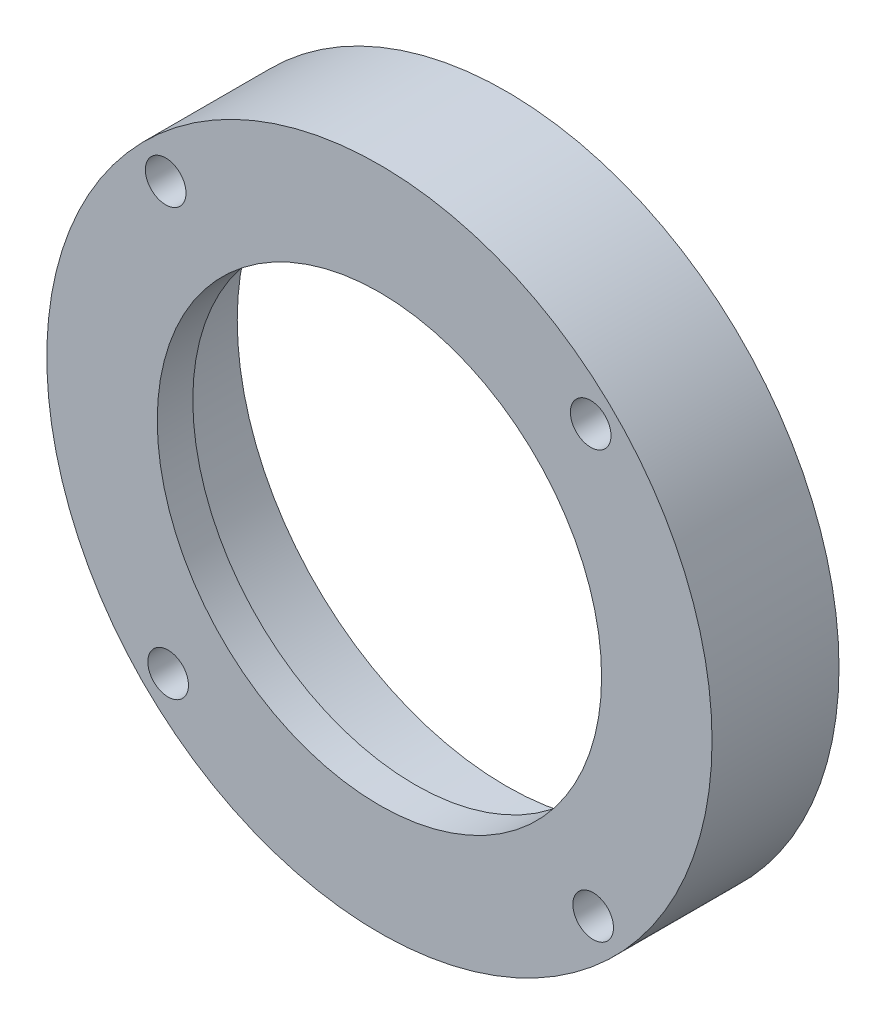
ISO-10303-21;
HEADER;
FILE_DESCRIPTION(('STEP AP214'),'2;1');
FILE_NAME('part.step','',(''),(''),'','','');
FILE_SCHEMA(('AUTOMOTIVE_DESIGN { 1 0 10303 214 1 1 1 1 }'));
ENDSEC;
DATA;
#1=APPLICATION_CONTEXT('core data for automotive mechanical design processes');
#2=APPLICATION_PROTOCOL_DEFINITION('international standard','automotive_design',2000,#1);
#3=PRODUCT_CONTEXT('',#1,'mechanical');
#4=PRODUCT('Part','Part','',(#3));
#5=PRODUCT_RELATED_PRODUCT_CATEGORY('part','',(#4));
#6=PRODUCT_DEFINITION_FORMATION('','',#4);
#7=PRODUCT_DEFINITION_CONTEXT('part definition',#1,'design');
#8=PRODUCT_DEFINITION('design','',#6,#7);
#9=PRODUCT_DEFINITION_SHAPE('','',#8);
#10=(LENGTH_UNIT() NAMED_UNIT(*) SI_UNIT(.MILLI.,.METRE.));
#11=(NAMED_UNIT(*) PLANE_ANGLE_UNIT() SI_UNIT($,.RADIAN.));
#12=(NAMED_UNIT(*) SI_UNIT($,.STERADIAN.) SOLID_ANGLE_UNIT());
#13=UNCERTAINTY_MEASURE_WITH_UNIT(LENGTH_MEASURE(1.E-05),#10,'distance_accuracy_value','');
#14=(GEOMETRIC_REPRESENTATION_CONTEXT(3) GLOBAL_UNCERTAINTY_ASSIGNED_CONTEXT((#13)) GLOBAL_UNIT_ASSIGNED_CONTEXT((#10,
#11,#12)) REPRESENTATION_CONTEXT('',''));
#15=CARTESIAN_POINT('',(0.,0.,0.));
#16=DIRECTION('',(0.,0.,1.));
#17=DIRECTION('',(1.,0.,0.));
#18=AXIS2_PLACEMENT_3D('',#15,#16,#17);
#19=CARTESIAN_POINT('',(0.,0.,10.));
#20=DIRECTION('',(0.,0.,-1.));
#21=DIRECTION('',(-1.,0.,0.));
#22=AXIS2_PLACEMENT_3D('',#19,#20,#21);
#23=CYLINDRICAL_SURFACE('',#22,17.4999999999991);
#24=CARTESIAN_POINT('',(0.,0.,10.));
#25=DIRECTION('',(0.,0.,1.));
#26=DIRECTION('',(1.,0.,0.));
#27=AXIS2_PLACEMENT_3D('',#24,#25,#26);
#28=CIRCLE('',#27,17.4999999999991);
#29=CARTESIAN_POINT('',(17.4999999999991,0.,10.));
#30=VERTEX_POINT('',#29);
#31=EDGE_CURVE('E66',#30,#30,#28,.T.);
#32=ORIENTED_EDGE('',*,*,#31,.T.);
#33=EDGE_LOOP('',(#32));
#34=FACE_BOUND('',#33,.T.);
#35=CARTESIAN_POINT('',(0.,0.,7.2));
#36=DIRECTION('',(0.,0.,-1.));
#37=DIRECTION('',(-1.,0.,0.));
#38=AXIS2_PLACEMENT_3D('',#35,#36,#37);
#39=CIRCLE('',#38,17.4999999999991);
#40=CARTESIAN_POINT('',(-17.4999999999991,0.,7.2));
#41=VERTEX_POINT('',#40);
#42=EDGE_CURVE('E34',#41,#41,#39,.T.);
#43=ORIENTED_EDGE('',*,*,#42,.T.);
#44=EDGE_LOOP('',(#43));
#45=FACE_BOUND('',#44,.T.);
#46=ADVANCED_FACE('F30',(#34,#45),#23,.F.);
#47=CARTESIAN_POINT('',(0.,0.,10.));
#48=DIRECTION('',(0.,0.,1.));
#49=DIRECTION('',(1.,0.,0.));
#50=AXIS2_PLACEMENT_3D('',#47,#48,#49);
#51=PLANE('',#50);
#52=CARTESIAN_POINT('',(-16.8361422961868,16.6414331426836,10.));
#53=DIRECTION('',(0.,0.,1.));
#54=DIRECTION('',(1.,0.,0.));
#55=AXIS2_PLACEMENT_3D('',#52,#53,#54);
#56=CIRCLE('',#55,1.6);
#57=CARTESIAN_POINT('',(-15.2361422961868,16.6414331426836,10.));
#58=VERTEX_POINT('',#57);
#59=EDGE_CURVE('E60',#58,#58,#56,.T.);
#60=ORIENTED_EDGE('',*,*,#59,.F.);
#61=EDGE_LOOP('',(#60));
#62=FACE_BOUND('',#61,.T.);
#63=CARTESIAN_POINT('',(16.8355428614329,-16.6417427396348,10.));
#64=DIRECTION('',(0.,0.,1.));
#65=DIRECTION('',(1.,0.,0.));
#66=AXIS2_PLACEMENT_3D('',#63,#64,#65);
#67=CIRCLE('',#66,1.6);
#68=CARTESIAN_POINT('',(18.4355428614329,-16.6417427396348,10.));
#69=VERTEX_POINT('',#68);
#70=EDGE_CURVE('E48',#69,#69,#67,.T.);
#71=ORIENTED_EDGE('',*,*,#70,.F.);
#72=EDGE_LOOP('',(#71));
#73=FACE_BOUND('',#72,.T.);
#74=CARTESIAN_POINT('',(0.,0.,10.));
#75=DIRECTION('',(0.,0.,1.));
#76=DIRECTION('',(1.,0.,0.));
#77=AXIS2_PLACEMENT_3D('',#74,#75,#76);
#78=CIRCLE('',#77,26.2000000000002);
#79=CARTESIAN_POINT('',(26.2000000000002,0.,10.));
#80=VERTEX_POINT('',#79);
#81=EDGE_CURVE('E10',#80,#80,#78,.T.);
#82=ORIENTED_EDGE('',*,*,#81,.T.);
#83=EDGE_LOOP('',(#82));
#84=FACE_BOUND('',#83,.T.);
#85=CARTESIAN_POINT('',(16.6412882237822,16.8356877803343,10.));
#86=DIRECTION('',(0.,0.,1.));
#87=DIRECTION('',(1.,0.,0.));
#88=AXIS2_PLACEMENT_3D('',#85,#86,#87);
#89=CIRCLE('',#88,1.6);
#90=CARTESIAN_POINT('',(18.2412882237822,16.8356877803343,10.));
#91=VERTEX_POINT('',#90);
#92=EDGE_CURVE('E43',#91,#91,#89,.T.);
#93=ORIENTED_EDGE('',*,*,#92,.F.);
#94=EDGE_LOOP('',(#93));
#95=FACE_BOUND('',#94,.T.);
#96=CARTESIAN_POINT('',(-16.6418876585361,-16.8359973772855,10.));
#97=DIRECTION('',(0.,0.,1.));
#98=DIRECTION('',(1.,0.,0.));
#99=AXIS2_PLACEMENT_3D('',#96,#97,#98);
#100=CIRCLE('',#99,1.6);
#101=CARTESIAN_POINT('',(-15.0418876585361,-16.8359973772855,10.));
#102=VERTEX_POINT('',#101);
#103=EDGE_CURVE('E54',#102,#102,#100,.T.);
#104=ORIENTED_EDGE('',*,*,#103,.F.);
#105=EDGE_LOOP('',(#104));
#106=FACE_BOUND('',#105,.T.);
#107=ORIENTED_EDGE('',*,*,#31,.F.);
#108=EDGE_LOOP('',(#107));
#109=FACE_BOUND('',#108,.T.);
#110=ADVANCED_FACE('F93',(#62,#73,#84,#95,#106,#109),#51,.T.);
#111=CARTESIAN_POINT('',(0.,0.,0.));
#112=DIRECTION('',(0.,0.,1.));
#113=DIRECTION('',(1.,0.,0.));
#114=AXIS2_PLACEMENT_3D('',#111,#112,#113);
#115=PLANE('',#114);
#116=CARTESIAN_POINT('',(0.,0.,0.));
#117=DIRECTION('',(0.,0.,-1.));
#118=DIRECTION('',(-1.,0.,0.));
#119=AXIS2_PLACEMENT_3D('',#116,#117,#118);
#120=CIRCLE('',#119,21.2);
#121=CARTESIAN_POINT('',(-21.2,0.,0.));
#122=VERTEX_POINT('',#121);
#123=EDGE_CURVE('E71',#122,#122,#120,.T.);
#124=ORIENTED_EDGE('',*,*,#123,.F.);
#125=EDGE_LOOP('',(#124));
#126=FACE_BOUND('',#125,.T.);
#127=CARTESIAN_POINT('',(0.,0.,0.));
#128=DIRECTION('',(0.,0.,1.));
#129=DIRECTION('',(1.,0.,0.));
#130=AXIS2_PLACEMENT_3D('',#127,#128,#129);
#131=CIRCLE('',#130,26.2000000000002);
#132=CARTESIAN_POINT('',(26.2000000000002,0.,0.));
#133=VERTEX_POINT('',#132);
#134=EDGE_CURVE('E38',#133,#133,#131,.T.);
#135=ORIENTED_EDGE('',*,*,#134,.F.);
#136=EDGE_LOOP('',(#135));
#137=FACE_BOUND('',#136,.T.);
#138=CARTESIAN_POINT('',(16.6412882237822,16.8356877803343,0.));
#139=DIRECTION('',(0.,0.,1.));
#140=DIRECTION('',(1.,0.,0.));
#141=AXIS2_PLACEMENT_3D('',#138,#139,#140);
#142=CIRCLE('',#141,1.6);
#143=CARTESIAN_POINT('',(18.2412882237822,16.8356877803343,0.));
#144=VERTEX_POINT('',#143);
#145=EDGE_CURVE('E45',#144,#144,#142,.T.);
#146=ORIENTED_EDGE('',*,*,#145,.T.);
#147=EDGE_LOOP('',(#146));
#148=FACE_BOUND('',#147,.T.);
#149=CARTESIAN_POINT('',(16.8355428614329,-16.6417427396348,0.));
#150=DIRECTION('',(0.,0.,1.));
#151=DIRECTION('',(1.,0.,0.));
#152=AXIS2_PLACEMENT_3D('',#149,#150,#151);
#153=CIRCLE('',#152,1.6);
#154=CARTESIAN_POINT('',(18.4355428614329,-16.6417427396348,0.));
#155=VERTEX_POINT('',#154);
#156=EDGE_CURVE('E51',#155,#155,#153,.T.);
#157=ORIENTED_EDGE('',*,*,#156,.T.);
#158=EDGE_LOOP('',(#157));
#159=FACE_BOUND('',#158,.T.);
#160=CARTESIAN_POINT('',(-16.6418876585361,-16.8359973772855,0.));
#161=DIRECTION('',(0.,0.,1.));
#162=DIRECTION('',(1.,0.,0.));
#163=AXIS2_PLACEMENT_3D('',#160,#161,#162);
#164=CIRCLE('',#163,1.6);
#165=CARTESIAN_POINT('',(-15.0418876585361,-16.8359973772855,0.));
#166=VERTEX_POINT('',#165);
#167=EDGE_CURVE('E57',#166,#166,#164,.T.);
#168=ORIENTED_EDGE('',*,*,#167,.T.);
#169=EDGE_LOOP('',(#168));
#170=FACE_BOUND('',#169,.T.);
#171=CARTESIAN_POINT('',(-16.8361422961868,16.6414331426836,0.));
#172=DIRECTION('',(0.,0.,1.));
#173=DIRECTION('',(1.,0.,0.));
#174=AXIS2_PLACEMENT_3D('',#171,#172,#173);
#175=CIRCLE('',#174,1.6);
#176=CARTESIAN_POINT('',(-15.2361422961868,16.6414331426836,0.));
#177=VERTEX_POINT('',#176);
#178=EDGE_CURVE('E63',#177,#177,#175,.T.);
#179=ORIENTED_EDGE('',*,*,#178,.T.);
#180=EDGE_LOOP('',(#179));
#181=FACE_BOUND('',#180,.T.);
#182=ADVANCED_FACE('F99',(#126,#137,#148,#159,#170,#181),#115,.F.);
#183=CARTESIAN_POINT('',(0.,0.,10.));
#184=DIRECTION('',(0.,0.,-1.));
#185=DIRECTION('',(-1.,0.,0.));
#186=AXIS2_PLACEMENT_3D('',#183,#184,#185);
#187=CYLINDRICAL_SURFACE('',#186,26.2000000000002);
#188=ORIENTED_EDGE('',*,*,#81,.F.);
#189=EDGE_LOOP('',(#188));
#190=FACE_BOUND('',#189,.T.);
#191=ORIENTED_EDGE('',*,*,#134,.T.);
#192=EDGE_LOOP('',(#191));
#193=FACE_BOUND('',#192,.T.);
#194=ADVANCED_FACE('F32',(#190,#193),#187,.T.);
#195=CARTESIAN_POINT('',(16.6412882237822,16.8356877803343,10.));
#196=DIRECTION('',(0.,0.,-1.));
#197=DIRECTION('',(-1.,0.,0.));
#198=AXIS2_PLACEMENT_3D('',#195,#196,#197);
#199=CYLINDRICAL_SURFACE('',#198,1.6);
#200=ORIENTED_EDGE('',*,*,#92,.T.);
#201=EDGE_LOOP('',(#200));
#202=FACE_BOUND('',#201,.T.);
#203=ORIENTED_EDGE('',*,*,#145,.F.);
#204=EDGE_LOOP('',(#203));
#205=FACE_BOUND('',#204,.T.);
#206=ADVANCED_FACE('F113',(#202,#205),#199,.F.);
#207=CARTESIAN_POINT('',(16.8355428614329,-16.6417427396348,10.));
#208=DIRECTION('',(0.,0.,-1.));
#209=DIRECTION('',(-1.,0.,0.));
#210=AXIS2_PLACEMENT_3D('',#207,#208,#209);
#211=CYLINDRICAL_SURFACE('',#210,1.6);
#212=ORIENTED_EDGE('',*,*,#70,.T.);
#213=EDGE_LOOP('',(#212));
#214=FACE_BOUND('',#213,.T.);
#215=ORIENTED_EDGE('',*,*,#156,.F.);
#216=EDGE_LOOP('',(#215));
#217=FACE_BOUND('',#216,.T.);
#218=ADVANCED_FACE('F109',(#214,#217),#211,.F.);
#219=CARTESIAN_POINT('',(-16.6418876585361,-16.8359973772855,10.));
#220=DIRECTION('',(0.,0.,-1.));
#221=DIRECTION('',(-1.,0.,0.));
#222=AXIS2_PLACEMENT_3D('',#219,#220,#221);
#223=CYLINDRICAL_SURFACE('',#222,1.6);
#224=ORIENTED_EDGE('',*,*,#103,.T.);
#225=EDGE_LOOP('',(#224));
#226=FACE_BOUND('',#225,.T.);
#227=ORIENTED_EDGE('',*,*,#167,.F.);
#228=EDGE_LOOP('',(#227));
#229=FACE_BOUND('',#228,.T.);
#230=ADVANCED_FACE('F105',(#226,#229),#223,.F.);
#231=CARTESIAN_POINT('',(-16.8361422961868,16.6414331426836,10.));
#232=DIRECTION('',(0.,0.,-1.));
#233=DIRECTION('',(-1.,0.,0.));
#234=AXIS2_PLACEMENT_3D('',#231,#232,#233);
#235=CYLINDRICAL_SURFACE('',#234,1.6);
#236=ORIENTED_EDGE('',*,*,#59,.T.);
#237=EDGE_LOOP('',(#236));
#238=FACE_BOUND('',#237,.T.);
#239=ORIENTED_EDGE('',*,*,#178,.F.);
#240=EDGE_LOOP('',(#239));
#241=FACE_BOUND('',#240,.T.);
#242=ADVANCED_FACE('F89',(#238,#241),#235,.F.);
#243=CARTESIAN_POINT('',(0.,0.,7.2));
#244=DIRECTION('',(0.,0.,-1.));
#245=DIRECTION('',(-1.,0.,0.));
#246=AXIS2_PLACEMENT_3D('',#243,#244,#245);
#247=CYLINDRICAL_SURFACE('',#246,21.2);
#248=CARTESIAN_POINT('',(0.,0.,7.2));
#249=DIRECTION('',(0.,0.,-1.));
#250=DIRECTION('',(-1.,0.,0.));
#251=AXIS2_PLACEMENT_3D('',#248,#249,#250);
#252=CIRCLE('',#251,21.2);
#253=CARTESIAN_POINT('',(-21.2,0.,7.2));
#254=VERTEX_POINT('',#253);
#255=EDGE_CURVE('E74',#254,#254,#252,.T.);
#256=ORIENTED_EDGE('',*,*,#255,.F.);
#257=EDGE_LOOP('',(#256));
#258=FACE_BOUND('',#257,.T.);
#259=ORIENTED_EDGE('',*,*,#123,.T.);
#260=EDGE_LOOP('',(#259));
#261=FACE_BOUND('',#260,.T.);
#262=ADVANCED_FACE('F84',(#258,#261),#247,.F.);
#263=CARTESIAN_POINT('',(0.,0.,7.2));
#264=DIRECTION('',(0.,0.,-1.));
#265=DIRECTION('',(-1.,0.,0.));
#266=AXIS2_PLACEMENT_3D('',#263,#264,#265);
#267=PLANE('',#266);
#268=ORIENTED_EDGE('',*,*,#42,.F.);
#269=EDGE_LOOP('',(#268));
#270=FACE_BOUND('',#269,.T.);
#271=ORIENTED_EDGE('',*,*,#255,.T.);
#272=EDGE_LOOP('',(#271));
#273=FACE_BOUND('',#272,.T.);
#274=ADVANCED_FACE('F82',(#270,#273),#267,.T.);
#275=CLOSED_SHELL('',(#46,#110,#182,#194,#206,#218,#230,#242,#262,#274));
#276=MANIFOLD_SOLID_BREP('B2',#275);
#277=ADVANCED_BREP_SHAPE_REPRESENTATION('',(#18,#276),#14);
#278=SHAPE_DEFINITION_REPRESENTATION(#9,#277);
ENDSEC;
END-ISO-10303-21;
